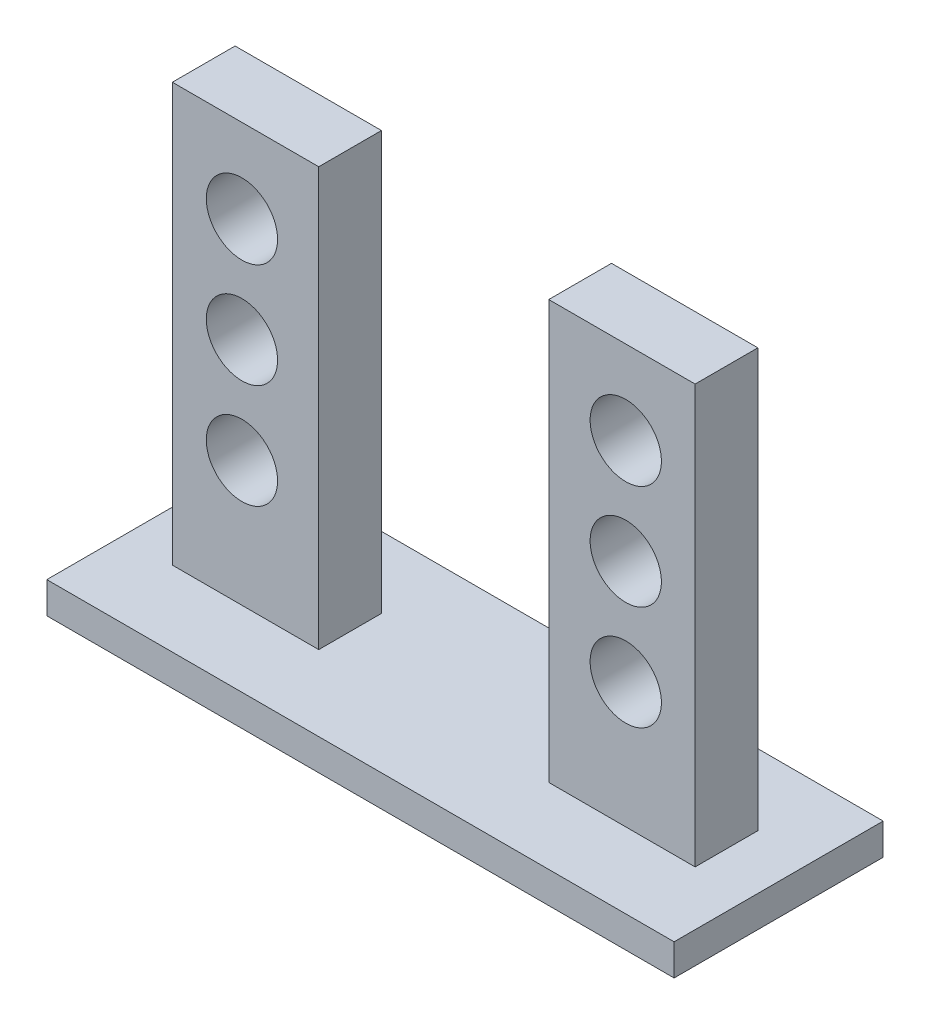
ISO-10303-21;
HEADER;
FILE_DESCRIPTION(('STEP AP214'),'2;1');
FILE_NAME('part.step','',(''),(''),'','','');
FILE_SCHEMA(('AUTOMOTIVE_DESIGN { 1 0 10303 214 1 1 1 1 }'));
ENDSEC;
DATA;
#1=APPLICATION_CONTEXT('core data for automotive mechanical design processes');
#2=APPLICATION_PROTOCOL_DEFINITION('international standard','automotive_design',2000,#1);
#3=PRODUCT_CONTEXT('',#1,'mechanical');
#4=PRODUCT('Part','Part','',(#3));
#5=PRODUCT_RELATED_PRODUCT_CATEGORY('part','',(#4));
#6=PRODUCT_DEFINITION_FORMATION('','',#4);
#7=PRODUCT_DEFINITION_CONTEXT('part definition',#1,'design');
#8=PRODUCT_DEFINITION('design','',#6,#7);
#9=PRODUCT_DEFINITION_SHAPE('','',#8);
#10=(LENGTH_UNIT() NAMED_UNIT(*) SI_UNIT(.MILLI.,.METRE.));
#11=(NAMED_UNIT(*) PLANE_ANGLE_UNIT() SI_UNIT($,.RADIAN.));
#12=(NAMED_UNIT(*) SI_UNIT($,.STERADIAN.) SOLID_ANGLE_UNIT());
#13=UNCERTAINTY_MEASURE_WITH_UNIT(LENGTH_MEASURE(1.E-05),#10,'distance_accuracy_value','');
#14=(GEOMETRIC_REPRESENTATION_CONTEXT(3) GLOBAL_UNCERTAINTY_ASSIGNED_CONTEXT((#13)) GLOBAL_UNIT_ASSIGNED_CONTEXT((#10,
#11,#12)) REPRESENTATION_CONTEXT('',''));
#15=CARTESIAN_POINT('',(0.,0.,0.));
#16=DIRECTION('',(0.,0.,1.));
#17=DIRECTION('',(1.,0.,0.));
#18=AXIS2_PLACEMENT_3D('',#15,#16,#17);
#19=CARTESIAN_POINT('',(8.29517143021079,6.,5.));
#20=DIRECTION('',(0.,0.,-1.));
#21=DIRECTION('',(-1.,0.,0.));
#22=AXIS2_PLACEMENT_3D('',#19,#20,#21);
#23=CYLINDRICAL_SURFACE('',#22,1.70499999999999);
#24=CARTESIAN_POINT('',(8.29517143021079,6.,1.39737281974683));
#25=DIRECTION('',(0.,0.,-1.));
#26=DIRECTION('',(-1.,0.,0.));
#27=AXIS2_PLACEMENT_3D('',#24,#25,#26);
#28=CIRCLE('',#27,1.70499999999999);
#29=CARTESIAN_POINT('',(6.59017143021079,6.,1.39737281974683));
#30=VERTEX_POINT('',#29);
#31=EDGE_CURVE('E49',#30,#30,#28,.F.);
#32=ORIENTED_EDGE('',*,*,#31,.T.);
#33=EDGE_LOOP('',(#32));
#34=FACE_BOUND('',#33,.T.);
#35=CARTESIAN_POINT('',(8.29517143021079,6.,-1.60262718025317));
#36=DIRECTION('',(0.,0.,1.));
#37=DIRECTION('',(1.,0.,0.));
#38=AXIS2_PLACEMENT_3D('',#35,#36,#37);
#39=CIRCLE('',#38,1.70499999999999);
#40=CARTESIAN_POINT('',(10.0001714302108,6.,-1.60262718025317));
#41=VERTEX_POINT('',#40);
#42=EDGE_CURVE('E11',#41,#41,#39,.F.);
#43=ORIENTED_EDGE('',*,*,#42,.T.);
#44=EDGE_LOOP('',(#43));
#45=FACE_BOUND('',#44,.T.);
#46=ADVANCED_FACE('F41',(#34,#45),#23,.F.);
#47=CARTESIAN_POINT('',(-10.0595208998725,6.,5.));
#48=DIRECTION('',(0.,0.,-1.));
#49=DIRECTION('',(-1.,0.,0.));
#50=AXIS2_PLACEMENT_3D('',#47,#48,#49);
#51=CYLINDRICAL_SURFACE('',#50,1.70499999999999);
#52=CARTESIAN_POINT('',(-10.0595208998725,6.,1.39737281974683));
#53=DIRECTION('',(0.,0.,-1.));
#54=DIRECTION('',(-1.,0.,0.));
#55=AXIS2_PLACEMENT_3D('',#52,#53,#54);
#56=CIRCLE('',#55,1.70499999999999);
#57=CARTESIAN_POINT('',(-11.7645208998725,6.,1.39737281974683));
#58=VERTEX_POINT('',#57);
#59=EDGE_CURVE('E239',#58,#58,#56,.F.);
#60=ORIENTED_EDGE('',*,*,#59,.T.);
#61=EDGE_LOOP('',(#60));
#62=FACE_BOUND('',#61,.T.);
#63=CARTESIAN_POINT('',(-10.0595208998725,6.,-1.60262718025317));
#64=DIRECTION('',(0.,0.,1.));
#65=DIRECTION('',(1.,0.,0.));
#66=AXIS2_PLACEMENT_3D('',#63,#64,#65);
#67=CIRCLE('',#66,1.70499999999999);
#68=CARTESIAN_POINT('',(-8.35452089987251,6.,-1.60262718025317));
#69=VERTEX_POINT('',#68);
#70=EDGE_CURVE('E264',#69,#69,#67,.F.);
#71=ORIENTED_EDGE('',*,*,#70,.T.);
#72=EDGE_LOOP('',(#71));
#73=FACE_BOUND('',#72,.T.);
#74=ADVANCED_FACE('F289',(#62,#73),#51,.F.);
#75=CARTESIAN_POINT('',(0.,0.,0.));
#76=DIRECTION('',(0.,-1.,0.));
#77=DIRECTION('',(0.,0.,-1.));
#78=AXIS2_PLACEMENT_3D('',#75,#76,#77);
#79=PLANE('',#78);
#80=DIRECTION('',(0.,0.,-1.));
#81=VECTOR('',#80,1.);
#82=CARTESIAN_POINT('',(-6.38673518574037,0.,1.39737281974683));
#83=LINE('',#82,#81);
#84=CARTESIAN_POINT('',(-6.38673518574037,0.,1.39737281974683));
#85=VERTEX_POINT('',#84);
#86=CARTESIAN_POINT('',(-6.38673518574037,0.,-1.60262718025317));
#87=VERTEX_POINT('',#86);
#88=EDGE_CURVE('E155',#85,#87,#83,.T.);
#89=ORIENTED_EDGE('',*,*,#88,.F.);
#90=DIRECTION('',(1.,0.,0.));
#91=VECTOR('',#90,1.);
#92=CARTESIAN_POINT('',(-13.3867351857404,0.,1.39737281974683));
#93=LINE('',#92,#91);
#94=CARTESIAN_POINT('',(-13.3867351857404,0.,1.39737281974683));
#95=VERTEX_POINT('',#94);
#96=EDGE_CURVE('E171',#95,#85,#93,.T.);
#97=ORIENTED_EDGE('',*,*,#96,.F.);
#98=DIRECTION('',(0.,0.,1.));
#99=VECTOR('',#98,1.);
#100=CARTESIAN_POINT('',(-13.3867351857404,0.,1.39737281974683));
#101=LINE('',#100,#99);
#102=CARTESIAN_POINT('',(-13.3867351857404,0.,-1.60262718025317));
#103=VERTEX_POINT('',#102);
#104=EDGE_CURVE('E184',#103,#95,#101,.T.);
#105=ORIENTED_EDGE('',*,*,#104,.F.);
#106=DIRECTION('',(-1.,0.,0.));
#107=VECTOR('',#106,1.);
#108=CARTESIAN_POINT('',(-13.3867351857404,0.,-1.60262718025317));
#109=LINE('',#108,#107);
#110=EDGE_CURVE('E160',#87,#103,#109,.T.);
#111=ORIENTED_EDGE('',*,*,#110,.F.);
#112=EDGE_LOOP('',(#89,#97,#105,#111));
#113=FACE_BOUND('',#112,.T.);
#114=DIRECTION('',(-1.,0.,0.));
#115=VECTOR('',#114,1.);
#116=CARTESIAN_POINT('',(4.21052631578949,0.,-5.));
#117=LINE('',#116,#115);
#118=CARTESIAN_POINT('',(14.2105263157895,0.,-5.));
#119=VERTEX_POINT('',#118);
#120=CARTESIAN_POINT('',(-15.7894736842105,0.,-5.));
#121=VERTEX_POINT('',#120);
#122=EDGE_CURVE('E211',#119,#121,#117,.T.);
#123=ORIENTED_EDGE('',*,*,#122,.T.);
#124=DIRECTION('',(0.,0.,1.));
#125=VECTOR('',#124,1.);
#126=CARTESIAN_POINT('',(-15.7894736842105,0.,-5.));
#127=LINE('',#126,#125);
#128=CARTESIAN_POINT('',(-15.7894736842105,0.,5.));
#129=VERTEX_POINT('',#128);
#130=EDGE_CURVE('E206',#121,#129,#127,.T.);
#131=ORIENTED_EDGE('',*,*,#130,.T.);
#132=DIRECTION('',(1.,0.,0.));
#133=VECTOR('',#132,1.);
#134=CARTESIAN_POINT('',(4.21052631578949,0.,5.));
#135=LINE('',#134,#133);
#136=CARTESIAN_POINT('',(14.2105263157895,0.,5.));
#137=VERTEX_POINT('',#136);
#138=EDGE_CURVE('E226',#129,#137,#135,.T.);
#139=ORIENTED_EDGE('',*,*,#138,.T.);
#140=DIRECTION('',(0.,0.,-1.));
#141=VECTOR('',#140,1.);
#142=CARTESIAN_POINT('',(14.2105263157895,0.,-5.));
#143=LINE('',#142,#141);
#144=EDGE_CURVE('E230',#137,#119,#143,.T.);
#145=ORIENTED_EDGE('',*,*,#144,.T.);
#146=EDGE_LOOP('',(#123,#131,#139,#145));
#147=FACE_BOUND('',#146,.T.);
#148=DIRECTION('',(0.,0.,-1.));
#149=VECTOR('',#148,1.);
#150=CARTESIAN_POINT('',(11.6132648142596,0.,1.39737281974683));
#151=LINE('',#150,#149);
#152=CARTESIAN_POINT('',(11.6132648142596,0.,1.39737281974683));
#153=VERTEX_POINT('',#152);
#154=CARTESIAN_POINT('',(11.6132648142596,0.,-1.60262718025317));
#155=VERTEX_POINT('',#154);
#156=EDGE_CURVE('E153',#153,#155,#151,.T.);
#157=ORIENTED_EDGE('',*,*,#156,.F.);
#158=DIRECTION('',(1.,0.,0.));
#159=VECTOR('',#158,1.);
#160=CARTESIAN_POINT('',(4.61326481425963,0.,1.39737281974683));
#161=LINE('',#160,#159);
#162=CARTESIAN_POINT('',(4.61326481425963,0.,1.39737281974683));
#163=VERTEX_POINT('',#162);
#164=EDGE_CURVE('E150',#163,#153,#161,.T.);
#165=ORIENTED_EDGE('',*,*,#164,.F.);
#166=DIRECTION('',(0.,0.,1.));
#167=VECTOR('',#166,1.);
#168=CARTESIAN_POINT('',(4.61326481425963,0.,1.39737281974683));
#169=LINE('',#168,#167);
#170=CARTESIAN_POINT('',(4.61326481425963,0.,-1.60262718025317));
#171=VERTEX_POINT('',#170);
#172=EDGE_CURVE('E61',#171,#163,#169,.T.);
#173=ORIENTED_EDGE('',*,*,#172,.F.);
#174=DIRECTION('',(-1.,0.,0.));
#175=VECTOR('',#174,1.);
#176=CARTESIAN_POINT('',(4.61326481425963,0.,-1.60262718025317));
#177=LINE('',#176,#175);
#178=EDGE_CURVE('E56',#155,#171,#177,.T.);
#179=ORIENTED_EDGE('',*,*,#178,.F.);
#180=EDGE_LOOP('',(#157,#165,#173,#179));
#181=FACE_BOUND('',#180,.T.);
#182=ADVANCED_FACE('F293',(#113,#147,#181),#79,.F.);
#183=CARTESIAN_POINT('',(4.21052631578949,-1.5,-5.));
#184=DIRECTION('',(0.,0.,-1.));
#185=DIRECTION('',(-1.,0.,0.));
#186=AXIS2_PLACEMENT_3D('',#183,#184,#185);
#187=PLANE('',#186);
#188=ORIENTED_EDGE('',*,*,#122,.F.);
#189=DIRECTION('',(0.,1.,0.));
#190=VECTOR('',#189,1.);
#191=CARTESIAN_POINT('',(14.2105263157895,-1.5,-5.));
#192=LINE('',#191,#190);
#193=CARTESIAN_POINT('',(14.2105263157895,-1.5,-5.));
#194=VERTEX_POINT('',#193);
#195=EDGE_CURVE('E236',#194,#119,#192,.T.);
#196=ORIENTED_EDGE('',*,*,#195,.F.);
#197=DIRECTION('',(-1.,0.,0.));
#198=VECTOR('',#197,1.);
#199=CARTESIAN_POINT('',(-5.78947368421051,-1.5,-5.));
#200=LINE('',#199,#198);
#201=CARTESIAN_POINT('',(-15.7894736842105,-1.5,-5.));
#202=VERTEX_POINT('',#201);
#203=EDGE_CURVE('E207',#194,#202,#200,.T.);
#204=ORIENTED_EDGE('',*,*,#203,.T.);
#205=DIRECTION('',(0.,1.,0.));
#206=VECTOR('',#205,1.);
#207=CARTESIAN_POINT('',(-15.7894736842105,-1.5,-5.));
#208=LINE('',#207,#206);
#209=EDGE_CURVE('E222',#202,#121,#208,.T.);
#210=ORIENTED_EDGE('',*,*,#209,.T.);
#211=EDGE_LOOP('',(#188,#196,#204,#210));
#212=FACE_BOUND('',#211,.T.);
#213=ADVANCED_FACE('F298',(#212),#187,.T.);
#214=CARTESIAN_POINT('',(14.2105263157895,-1.5,-5.));
#215=DIRECTION('',(1.,0.,0.));
#216=DIRECTION('',(0.,0.,-1.));
#217=AXIS2_PLACEMENT_3D('',#214,#215,#216);
#218=PLANE('',#217);
#219=ORIENTED_EDGE('',*,*,#144,.F.);
#220=DIRECTION('',(0.,1.,0.));
#221=VECTOR('',#220,1.);
#222=CARTESIAN_POINT('',(14.2105263157895,-1.5,5.));
#223=LINE('',#222,#221);
#224=CARTESIAN_POINT('',(14.2105263157895,-1.5,5.));
#225=VERTEX_POINT('',#224);
#226=EDGE_CURVE('E240',#225,#137,#223,.T.);
#227=ORIENTED_EDGE('',*,*,#226,.F.);
#228=DIRECTION('',(0.,0.,-1.));
#229=VECTOR('',#228,1.);
#230=CARTESIAN_POINT('',(14.2105263157895,-1.5,-5.));
#231=LINE('',#230,#229);
#232=EDGE_CURVE('E218',#225,#194,#231,.T.);
#233=ORIENTED_EDGE('',*,*,#232,.T.);
#234=ORIENTED_EDGE('',*,*,#195,.T.);
#235=EDGE_LOOP('',(#219,#227,#233,#234));
#236=FACE_BOUND('',#235,.T.);
#237=ADVANCED_FACE('F311',(#236),#218,.T.);
#238=CARTESIAN_POINT('',(4.21052631578949,-1.5,5.));
#239=DIRECTION('',(0.,0.,1.));
#240=DIRECTION('',(1.,0.,0.));
#241=AXIS2_PLACEMENT_3D('',#238,#239,#240);
#242=PLANE('',#241);
#243=ORIENTED_EDGE('',*,*,#138,.F.);
#244=DIRECTION('',(0.,1.,0.));
#245=VECTOR('',#244,1.);
#246=CARTESIAN_POINT('',(-15.7894736842105,-1.5,5.));
#247=LINE('',#246,#245);
#248=CARTESIAN_POINT('',(-15.7894736842105,-1.5,5.));
#249=VERTEX_POINT('',#248);
#250=EDGE_CURVE('E243',#249,#129,#247,.T.);
#251=ORIENTED_EDGE('',*,*,#250,.F.);
#252=DIRECTION('',(1.,0.,0.));
#253=VECTOR('',#252,1.);
#254=CARTESIAN_POINT('',(-5.78947368421051,-1.5,5.));
#255=LINE('',#254,#253);
#256=EDGE_CURVE('E215',#249,#225,#255,.T.);
#257=ORIENTED_EDGE('',*,*,#256,.T.);
#258=ORIENTED_EDGE('',*,*,#226,.T.);
#259=EDGE_LOOP('',(#243,#251,#257,#258));
#260=FACE_BOUND('',#259,.T.);
#261=ADVANCED_FACE('F307',(#260),#242,.T.);
#262=CARTESIAN_POINT('',(-15.7894736842105,-1.5,-5.));
#263=DIRECTION('',(-1.,0.,0.));
#264=DIRECTION('',(0.,0.,1.));
#265=AXIS2_PLACEMENT_3D('',#262,#263,#264);
#266=PLANE('',#265);
#267=ORIENTED_EDGE('',*,*,#130,.F.);
#268=ORIENTED_EDGE('',*,*,#209,.F.);
#269=DIRECTION('',(0.,0.,1.));
#270=VECTOR('',#269,1.);
#271=CARTESIAN_POINT('',(-15.7894736842105,-1.5,-5.));
#272=LINE('',#271,#270);
#273=EDGE_CURVE('E210',#202,#249,#272,.T.);
#274=ORIENTED_EDGE('',*,*,#273,.T.);
#275=ORIENTED_EDGE('',*,*,#250,.T.);
#276=EDGE_LOOP('',(#267,#268,#274,#275));
#277=FACE_BOUND('',#276,.T.);
#278=ADVANCED_FACE('F303',(#277),#266,.T.);
#279=CARTESIAN_POINT('',(0.,-1.5,0.));
#280=DIRECTION('',(0.,-1.,0.));
#281=DIRECTION('',(0.,0.,-1.));
#282=AXIS2_PLACEMENT_3D('',#279,#280,#281);
#283=PLANE('',#282);
#284=ORIENTED_EDGE('',*,*,#203,.F.);
#285=ORIENTED_EDGE('',*,*,#232,.F.);
#286=ORIENTED_EDGE('',*,*,#256,.F.);
#287=ORIENTED_EDGE('',*,*,#273,.F.);
#288=EDGE_LOOP('',(#284,#285,#286,#287));
#289=FACE_BOUND('',#288,.T.);
#290=ADVANCED_FACE('F306',(#289),#283,.T.);
#291=CARTESIAN_POINT('',(-6.38673518574037,20.,1.39737281974683));
#292=DIRECTION('',(-1.,0.,0.));
#293=DIRECTION('',(0.,0.,1.));
#294=AXIS2_PLACEMENT_3D('',#291,#292,#293);
#295=PLANE('',#294);
#296=ORIENTED_EDGE('',*,*,#88,.T.);
#297=DIRECTION('',(0.,-1.,0.));
#298=VECTOR('',#297,1.);
#299=CARTESIAN_POINT('',(-6.38673518574037,20.,-1.60262718025317));
#300=LINE('',#299,#298);
#301=CARTESIAN_POINT('',(-6.38673518574037,20.,-1.60262718025317));
#302=VERTEX_POINT('',#301);
#303=EDGE_CURVE('E202',#302,#87,#300,.T.);
#304=ORIENTED_EDGE('',*,*,#303,.F.);
#305=DIRECTION('',(0.,0.,-1.));
#306=VECTOR('',#305,1.);
#307=CARTESIAN_POINT('',(-6.38673518574037,20.,1.39737281974683));
#308=LINE('',#307,#306);
#309=CARTESIAN_POINT('',(-6.38673518574037,20.,1.39737281974683));
#310=VERTEX_POINT('',#309);
#311=EDGE_CURVE('E166',#310,#302,#308,.T.);
#312=ORIENTED_EDGE('',*,*,#311,.F.);
#313=DIRECTION('',(0.,-1.,0.));
#314=VECTOR('',#313,1.);
#315=CARTESIAN_POINT('',(-6.38673518574037,20.,1.39737281974683));
#316=LINE('',#315,#314);
#317=EDGE_CURVE('E179',#310,#85,#316,.T.);
#318=ORIENTED_EDGE('',*,*,#317,.T.);
#319=EDGE_LOOP('',(#296,#304,#312,#318));
#320=FACE_BOUND('',#319,.T.);
#321=ADVANCED_FACE('F321',(#320),#295,.F.);
#322=CARTESIAN_POINT('',(-13.3867351857404,20.,-1.60262718025317));
#323=DIRECTION('',(0.,0.,1.));
#324=DIRECTION('',(1.,0.,0.));
#325=AXIS2_PLACEMENT_3D('',#322,#323,#324);
#326=PLANE('',#325);
#327=CARTESIAN_POINT('',(-10.0595208998725,11.,-1.60262718025317));
#328=DIRECTION('',(0.,0.,1.));
#329=DIRECTION('',(1.,0.,0.));
#330=AXIS2_PLACEMENT_3D('',#327,#328,#329);
#331=CIRCLE('',#330,1.70499999999999);
#332=CARTESIAN_POINT('',(-8.35452089987251,11.,-1.60262718025317));
#333=VERTEX_POINT('',#332);
#334=EDGE_CURVE('E255',#333,#333,#331,.F.);
#335=ORIENTED_EDGE('',*,*,#334,.F.);
#336=EDGE_LOOP('',(#335));
#337=FACE_BOUND('',#336,.T.);
#338=CARTESIAN_POINT('',(-10.0595208998725,16.,-1.60262718025317));
#339=DIRECTION('',(0.,0.,1.));
#340=DIRECTION('',(1.,0.,0.));
#341=AXIS2_PLACEMENT_3D('',#338,#339,#340);
#342=CIRCLE('',#341,1.70499999999999);
#343=CARTESIAN_POINT('',(-8.35452089987251,16.,-1.60262718025317));
#344=VERTEX_POINT('',#343);
#345=EDGE_CURVE('E260',#344,#344,#342,.F.);
#346=ORIENTED_EDGE('',*,*,#345,.F.);
#347=EDGE_LOOP('',(#346));
#348=FACE_BOUND('',#347,.T.);
#349=ORIENTED_EDGE('',*,*,#110,.T.);
#350=DIRECTION('',(0.,-1.,0.));
#351=VECTOR('',#350,1.);
#352=CARTESIAN_POINT('',(-13.3867351857404,20.,-1.60262718025317));
#353=LINE('',#352,#351);
#354=CARTESIAN_POINT('',(-13.3867351857404,20.,-1.60262718025317));
#355=VERTEX_POINT('',#354);
#356=EDGE_CURVE('E198',#355,#103,#353,.T.);
#357=ORIENTED_EDGE('',*,*,#356,.F.);
#358=DIRECTION('',(-1.,0.,0.));
#359=VECTOR('',#358,1.);
#360=CARTESIAN_POINT('',(-13.3867351857404,20.,-1.60262718025317));
#361=LINE('',#360,#359);
#362=EDGE_CURVE('E170',#302,#355,#361,.T.);
#363=ORIENTED_EDGE('',*,*,#362,.F.);
#364=ORIENTED_EDGE('',*,*,#303,.T.);
#365=EDGE_LOOP('',(#349,#357,#363,#364));
#366=FACE_BOUND('',#365,.T.);
#367=ORIENTED_EDGE('',*,*,#70,.F.);
#368=EDGE_LOOP('',(#367));
#369=FACE_BOUND('',#368,.T.);
#370=ADVANCED_FACE('F325',(#337,#348,#366,#369),#326,.F.);
#371=CARTESIAN_POINT('',(-13.3867351857404,20.,1.39737281974683));
#372=DIRECTION('',(1.,0.,0.));
#373=DIRECTION('',(0.,0.,-1.));
#374=AXIS2_PLACEMENT_3D('',#371,#372,#373);
#375=PLANE('',#374);
#376=ORIENTED_EDGE('',*,*,#104,.T.);
#377=DIRECTION('',(0.,-1.,0.));
#378=VECTOR('',#377,1.);
#379=CARTESIAN_POINT('',(-13.3867351857404,20.,1.39737281974683));
#380=LINE('',#379,#378);
#381=CARTESIAN_POINT('',(-13.3867351857404,20.,1.39737281974683));
#382=VERTEX_POINT('',#381);
#383=EDGE_CURVE('E194',#382,#95,#380,.T.);
#384=ORIENTED_EDGE('',*,*,#383,.F.);
#385=DIRECTION('',(0.,0.,1.));
#386=VECTOR('',#385,1.);
#387=CARTESIAN_POINT('',(-13.3867351857404,20.,1.39737281974683));
#388=LINE('',#387,#386);
#389=EDGE_CURVE('E174',#355,#382,#388,.T.);
#390=ORIENTED_EDGE('',*,*,#389,.F.);
#391=ORIENTED_EDGE('',*,*,#356,.T.);
#392=EDGE_LOOP('',(#376,#384,#390,#391));
#393=FACE_BOUND('',#392,.T.);
#394=ADVANCED_FACE('F329',(#393),#375,.F.);
#395=CARTESIAN_POINT('',(-13.3867351857404,20.,1.39737281974683));
#396=DIRECTION('',(0.,0.,-1.));
#397=DIRECTION('',(-1.,0.,0.));
#398=AXIS2_PLACEMENT_3D('',#395,#396,#397);
#399=PLANE('',#398);
#400=CARTESIAN_POINT('',(-10.0595208998725,11.,1.39737281974683));
#401=DIRECTION('',(0.,0.,-1.));
#402=DIRECTION('',(-1.,0.,0.));
#403=AXIS2_PLACEMENT_3D('',#400,#401,#402);
#404=CIRCLE('',#403,1.70499999999999);
#405=CARTESIAN_POINT('',(-11.7645208998725,11.,1.39737281974683));
#406=VERTEX_POINT('',#405);
#407=EDGE_CURVE('E431',#406,#406,#404,.F.);
#408=ORIENTED_EDGE('',*,*,#407,.F.);
#409=EDGE_LOOP('',(#408));
#410=FACE_BOUND('',#409,.T.);
#411=CARTESIAN_POINT('',(-10.0595208998725,16.,1.39737281974683));
#412=DIRECTION('',(0.,0.,-1.));
#413=DIRECTION('',(-1.,0.,0.));
#414=AXIS2_PLACEMENT_3D('',#411,#412,#413);
#415=CIRCLE('',#414,1.70499999999999);
#416=CARTESIAN_POINT('',(-11.7645208998725,16.,1.39737281974683));
#417=VERTEX_POINT('',#416);
#418=EDGE_CURVE('E256',#417,#417,#415,.F.);
#419=ORIENTED_EDGE('',*,*,#418,.F.);
#420=EDGE_LOOP('',(#419));
#421=FACE_BOUND('',#420,.T.);
#422=ORIENTED_EDGE('',*,*,#96,.T.);
#423=ORIENTED_EDGE('',*,*,#317,.F.);
#424=DIRECTION('',(1.,0.,0.));
#425=VECTOR('',#424,1.);
#426=CARTESIAN_POINT('',(-13.3867351857404,20.,1.39737281974683));
#427=LINE('',#426,#425);
#428=EDGE_CURVE('E177',#382,#310,#427,.T.);
#429=ORIENTED_EDGE('',*,*,#428,.F.);
#430=ORIENTED_EDGE('',*,*,#383,.T.);
#431=EDGE_LOOP('',(#422,#423,#429,#430));
#432=FACE_BOUND('',#431,.T.);
#433=ORIENTED_EDGE('',*,*,#59,.F.);
#434=EDGE_LOOP('',(#433));
#435=FACE_BOUND('',#434,.T.);
#436=ADVANCED_FACE('F333',(#410,#421,#432,#435),#399,.F.);
#437=CARTESIAN_POINT('',(0.,20.,0.));
#438=DIRECTION('',(0.,-1.,0.));
#439=DIRECTION('',(0.,0.,-1.));
#440=AXIS2_PLACEMENT_3D('',#437,#438,#439);
#441=PLANE('',#440);
#442=ORIENTED_EDGE('',*,*,#311,.T.);
#443=ORIENTED_EDGE('',*,*,#362,.T.);
#444=ORIENTED_EDGE('',*,*,#389,.T.);
#445=ORIENTED_EDGE('',*,*,#428,.T.);
#446=EDGE_LOOP('',(#442,#443,#444,#445));
#447=FACE_BOUND('',#446,.T.);
#448=ADVANCED_FACE('F337',(#447),#441,.F.);
#449=CARTESIAN_POINT('',(11.6132648142596,20.,1.39737281974683));
#450=DIRECTION('',(-1.,0.,0.));
#451=DIRECTION('',(0.,0.,1.));
#452=AXIS2_PLACEMENT_3D('',#449,#450,#451);
#453=PLANE('',#452);
#454=ORIENTED_EDGE('',*,*,#156,.T.);
#455=DIRECTION('',(0.,-1.,0.));
#456=VECTOR('',#455,1.);
#457=CARTESIAN_POINT('',(11.6132648142596,20.,-1.60262718025317));
#458=LINE('',#457,#456);
#459=CARTESIAN_POINT('',(11.6132648142596,20.,-1.60262718025317));
#460=VERTEX_POINT('',#459);
#461=EDGE_CURVE('E132',#460,#155,#458,.T.);
#462=ORIENTED_EDGE('',*,*,#461,.F.);
#463=DIRECTION('',(0.,0.,-1.));
#464=VECTOR('',#463,1.);
#465=CARTESIAN_POINT('',(11.6132648142596,20.,1.39737281974683));
#466=LINE('',#465,#464);
#467=CARTESIAN_POINT('',(11.6132648142596,20.,1.39737281974683));
#468=VERTEX_POINT('',#467);
#469=EDGE_CURVE('E140',#468,#460,#466,.T.);
#470=ORIENTED_EDGE('',*,*,#469,.F.);
#471=DIRECTION('',(0.,-1.,0.));
#472=VECTOR('',#471,1.);
#473=CARTESIAN_POINT('',(11.6132648142596,20.,1.39737281974683));
#474=LINE('',#473,#472);
#475=EDGE_CURVE('E367',#468,#153,#474,.T.);
#476=ORIENTED_EDGE('',*,*,#475,.T.);
#477=EDGE_LOOP('',(#454,#462,#470,#476));
#478=FACE_BOUND('',#477,.T.);
#479=ADVANCED_FACE('F152',(#478),#453,.F.);
#480=CARTESIAN_POINT('',(4.61326481425963,20.,-1.60262718025317));
#481=DIRECTION('',(0.,0.,1.));
#482=DIRECTION('',(1.,0.,0.));
#483=AXIS2_PLACEMENT_3D('',#480,#481,#482);
#484=PLANE('',#483);
#485=CARTESIAN_POINT('',(8.29517143021079,11.,-1.60262718025317));
#486=DIRECTION('',(0.,0.,1.));
#487=DIRECTION('',(1.,0.,0.));
#488=AXIS2_PLACEMENT_3D('',#485,#486,#487);
#489=CIRCLE('',#488,1.70499999999999);
#490=CARTESIAN_POINT('',(10.0001714302108,11.,-1.60262718025317));
#491=VERTEX_POINT('',#490);
#492=EDGE_CURVE('E351',#491,#491,#489,.F.);
#493=ORIENTED_EDGE('',*,*,#492,.F.);
#494=EDGE_LOOP('',(#493));
#495=FACE_BOUND('',#494,.T.);
#496=CARTESIAN_POINT('',(8.29517143021079,16.,-1.60262718025317));
#497=DIRECTION('',(0.,0.,1.));
#498=DIRECTION('',(1.,0.,0.));
#499=AXIS2_PLACEMENT_3D('',#496,#497,#498);
#500=CIRCLE('',#499,1.70499999999999);
#501=CARTESIAN_POINT('',(10.0001714302108,16.,-1.60262718025317));
#502=VERTEX_POINT('',#501);
#503=EDGE_CURVE('E254',#502,#502,#500,.F.);
#504=ORIENTED_EDGE('',*,*,#503,.F.);
#505=EDGE_LOOP('',(#504));
#506=FACE_BOUND('',#505,.T.);
#507=ORIENTED_EDGE('',*,*,#178,.T.);
#508=DIRECTION('',(0.,-1.,0.));
#509=VECTOR('',#508,1.);
#510=CARTESIAN_POINT('',(4.61326481425963,20.,-1.60262718025317));
#511=LINE('',#510,#509);
#512=CARTESIAN_POINT('',(4.61326481425963,20.,-1.60262718025317));
#513=VERTEX_POINT('',#512);
#514=EDGE_CURVE('E135',#513,#171,#511,.T.);
#515=ORIENTED_EDGE('',*,*,#514,.F.);
#516=DIRECTION('',(-1.,0.,0.));
#517=VECTOR('',#516,1.);
#518=CARTESIAN_POINT('',(4.61326481425963,20.,-1.60262718025317));
#519=LINE('',#518,#517);
#520=EDGE_CURVE('E127',#460,#513,#519,.T.);
#521=ORIENTED_EDGE('',*,*,#520,.F.);
#522=ORIENTED_EDGE('',*,*,#461,.T.);
#523=EDGE_LOOP('',(#507,#515,#521,#522));
#524=FACE_BOUND('',#523,.T.);
#525=ORIENTED_EDGE('',*,*,#42,.F.);
#526=EDGE_LOOP('',(#525));
#527=FACE_BOUND('',#526,.T.);
#528=ADVANCED_FACE('F129',(#495,#506,#524,#527),#484,.F.);
#529=CARTESIAN_POINT('',(4.61326481425963,20.,1.39737281974683));
#530=DIRECTION('',(1.,0.,0.));
#531=DIRECTION('',(0.,0.,-1.));
#532=AXIS2_PLACEMENT_3D('',#529,#530,#531);
#533=PLANE('',#532);
#534=ORIENTED_EDGE('',*,*,#172,.T.);
#535=DIRECTION('',(0.,-1.,0.));
#536=VECTOR('',#535,1.);
#537=CARTESIAN_POINT('',(4.61326481425963,20.,1.39737281974683));
#538=LINE('',#537,#536);
#539=CARTESIAN_POINT('',(4.61326481425963,20.,1.39737281974683));
#540=VERTEX_POINT('',#539);
#541=EDGE_CURVE('E162',#540,#163,#538,.T.);
#542=ORIENTED_EDGE('',*,*,#541,.F.);
#543=DIRECTION('',(0.,0.,1.));
#544=VECTOR('',#543,1.);
#545=CARTESIAN_POINT('',(4.61326481425963,20.,1.39737281974683));
#546=LINE('',#545,#544);
#547=EDGE_CURVE('E139',#513,#540,#546,.T.);
#548=ORIENTED_EDGE('',*,*,#547,.F.);
#549=ORIENTED_EDGE('',*,*,#514,.T.);
#550=EDGE_LOOP('',(#534,#542,#548,#549));
#551=FACE_BOUND('',#550,.T.);
#552=ADVANCED_FACE('F275',(#551),#533,.F.);
#553=CARTESIAN_POINT('',(4.61326481425963,20.,1.39737281974683));
#554=DIRECTION('',(0.,0.,-1.));
#555=DIRECTION('',(-1.,0.,0.));
#556=AXIS2_PLACEMENT_3D('',#553,#554,#555);
#557=PLANE('',#556);
#558=CARTESIAN_POINT('',(8.29517143021079,11.,1.39737281974683));
#559=DIRECTION('',(0.,0.,-1.));
#560=DIRECTION('',(-1.,0.,0.));
#561=AXIS2_PLACEMENT_3D('',#558,#559,#560);
#562=CIRCLE('',#561,1.70499999999999);
#563=CARTESIAN_POINT('',(6.59017143021079,11.,1.39737281974683));
#564=VERTEX_POINT('',#563);
#565=EDGE_CURVE('E429',#564,#564,#562,.F.);
#566=ORIENTED_EDGE('',*,*,#565,.F.);
#567=EDGE_LOOP('',(#566));
#568=FACE_BOUND('',#567,.T.);
#569=CARTESIAN_POINT('',(8.29517143021079,16.,1.39737281974683));
#570=DIRECTION('',(0.,0.,-1.));
#571=DIRECTION('',(-1.,0.,0.));
#572=AXIS2_PLACEMENT_3D('',#569,#570,#571);
#573=CIRCLE('',#572,1.70499999999999);
#574=CARTESIAN_POINT('',(6.59017143021079,16.,1.39737281974683));
#575=VERTEX_POINT('',#574);
#576=EDGE_CURVE('E250',#575,#575,#573,.F.);
#577=ORIENTED_EDGE('',*,*,#576,.F.);
#578=EDGE_LOOP('',(#577));
#579=FACE_BOUND('',#578,.T.);
#580=ORIENTED_EDGE('',*,*,#164,.T.);
#581=ORIENTED_EDGE('',*,*,#475,.F.);
#582=DIRECTION('',(1.,0.,0.));
#583=VECTOR('',#582,1.);
#584=CARTESIAN_POINT('',(4.61326481425963,20.,1.39737281974683));
#585=LINE('',#584,#583);
#586=EDGE_CURVE('E145',#540,#468,#585,.T.);
#587=ORIENTED_EDGE('',*,*,#586,.F.);
#588=ORIENTED_EDGE('',*,*,#541,.T.);
#589=EDGE_LOOP('',(#580,#581,#587,#588));
#590=FACE_BOUND('',#589,.T.);
#591=ORIENTED_EDGE('',*,*,#31,.F.);
#592=EDGE_LOOP('',(#591));
#593=FACE_BOUND('',#592,.T.);
#594=ADVANCED_FACE('F273',(#568,#579,#590,#593),#557,.F.);
#595=CARTESIAN_POINT('',(0.,20.,0.));
#596=DIRECTION('',(0.,-1.,0.));
#597=DIRECTION('',(0.,0.,-1.));
#598=AXIS2_PLACEMENT_3D('',#595,#596,#597);
#599=PLANE('',#598);
#600=ORIENTED_EDGE('',*,*,#469,.T.);
#601=ORIENTED_EDGE('',*,*,#520,.T.);
#602=ORIENTED_EDGE('',*,*,#547,.T.);
#603=ORIENTED_EDGE('',*,*,#586,.T.);
#604=EDGE_LOOP('',(#600,#601,#602,#603));
#605=FACE_BOUND('',#604,.T.);
#606=ADVANCED_FACE('F143',(#605),#599,.F.);
#607=CARTESIAN_POINT('',(8.29517143021079,16.,5.));
#608=DIRECTION('',(0.,0.,-1.));
#609=DIRECTION('',(-1.,0.,0.));
#610=AXIS2_PLACEMENT_3D('',#607,#608,#609);
#611=CYLINDRICAL_SURFACE('',#610,1.70499999999999);
#612=ORIENTED_EDGE('',*,*,#576,.T.);
#613=EDGE_LOOP('',(#612));
#614=FACE_BOUND('',#613,.T.);
#615=ORIENTED_EDGE('',*,*,#503,.T.);
#616=EDGE_LOOP('',(#615));
#617=FACE_BOUND('',#616,.T.);
#618=ADVANCED_FACE('F282',(#614,#617),#611,.F.);
#619=CARTESIAN_POINT('',(-10.0595208998725,16.,5.));
#620=DIRECTION('',(0.,0.,-1.));
#621=DIRECTION('',(-1.,0.,0.));
#622=AXIS2_PLACEMENT_3D('',#619,#620,#621);
#623=CYLINDRICAL_SURFACE('',#622,1.70499999999999);
#624=ORIENTED_EDGE('',*,*,#418,.T.);
#625=EDGE_LOOP('',(#624));
#626=FACE_BOUND('',#625,.T.);
#627=ORIENTED_EDGE('',*,*,#345,.T.);
#628=EDGE_LOOP('',(#627));
#629=FACE_BOUND('',#628,.T.);
#630=ADVANCED_FACE('F384',(#626,#629),#623,.F.);
#631=CARTESIAN_POINT('',(-10.0595208998725,11.,5.));
#632=DIRECTION('',(0.,0.,-1.));
#633=DIRECTION('',(-1.,0.,0.));
#634=AXIS2_PLACEMENT_3D('',#631,#632,#633);
#635=CYLINDRICAL_SURFACE('',#634,1.70499999999999);
#636=ORIENTED_EDGE('',*,*,#407,.T.);
#637=EDGE_LOOP('',(#636));
#638=FACE_BOUND('',#637,.T.);
#639=ORIENTED_EDGE('',*,*,#334,.T.);
#640=EDGE_LOOP('',(#639));
#641=FACE_BOUND('',#640,.T.);
#642=ADVANCED_FACE('F410',(#638,#641),#635,.F.);
#643=CARTESIAN_POINT('',(8.29517143021079,11.,5.));
#644=DIRECTION('',(0.,0.,-1.));
#645=DIRECTION('',(-1.,0.,0.));
#646=AXIS2_PLACEMENT_3D('',#643,#644,#645);
#647=CYLINDRICAL_SURFACE('',#646,1.70499999999999);
#648=ORIENTED_EDGE('',*,*,#565,.T.);
#649=EDGE_LOOP('',(#648));
#650=FACE_BOUND('',#649,.T.);
#651=ORIENTED_EDGE('',*,*,#492,.T.);
#652=EDGE_LOOP('',(#651));
#653=FACE_BOUND('',#652,.T.);
#654=ADVANCED_FACE('F417',(#650,#653),#647,.F.);
#655=CLOSED_SHELL('',(#46,#74,#182,#213,#237,#261,#278,#290,#321,#370,#394,#436,#448,#479,#528,
#552,#594,#606,#618,#630,#642,#654));
#656=MANIFOLD_SOLID_BREP('B2',#655);
#657=ADVANCED_BREP_SHAPE_REPRESENTATION('',(#18,#656),#14);
#658=SHAPE_DEFINITION_REPRESENTATION(#9,#657);
ENDSEC;
END-ISO-10303-21;
